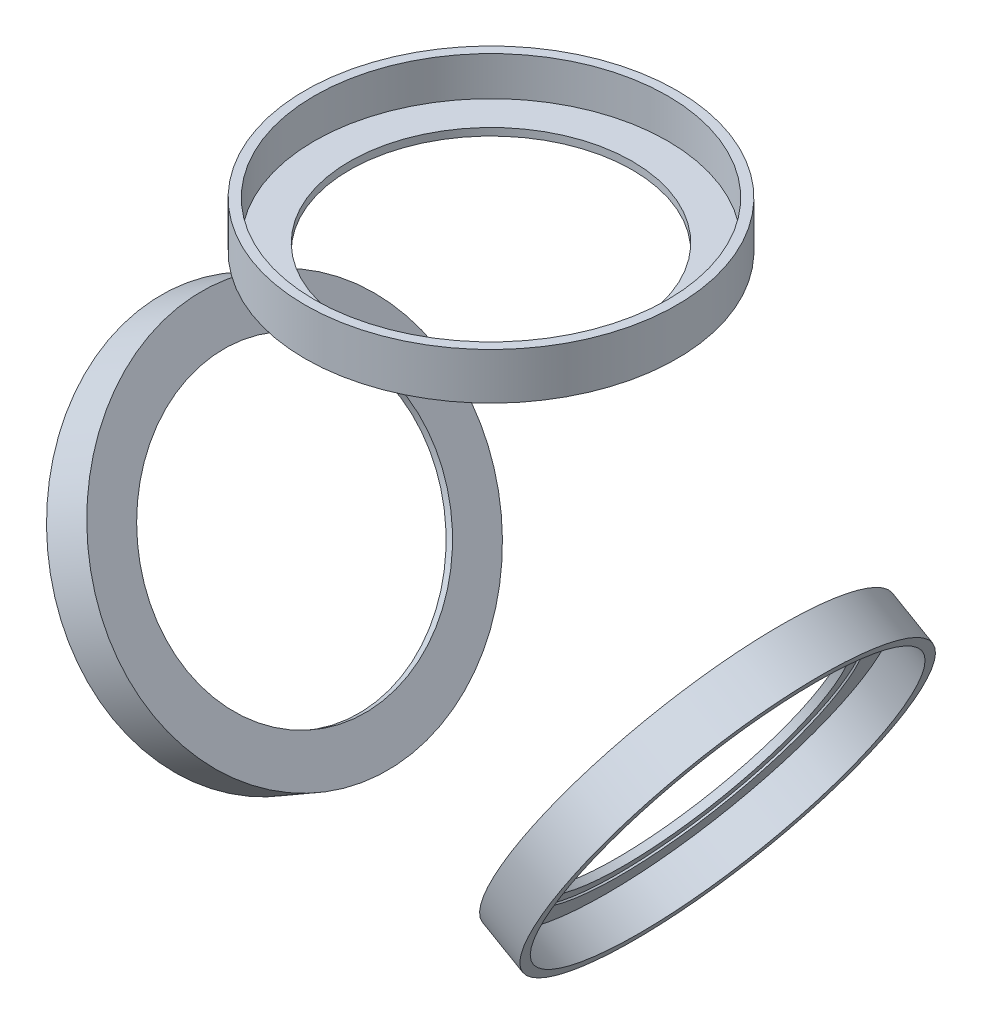
ISO-10303-21;
HEADER;
FILE_DESCRIPTION(('STEP AP214'),'2;1');
FILE_NAME('part.step','',(''),(''),'','','');
FILE_SCHEMA(('AUTOMOTIVE_DESIGN { 1 0 10303 214 1 1 1 1 }'));
ENDSEC;
DATA;
#1=APPLICATION_CONTEXT('core data for automotive mechanical design processes');
#2=APPLICATION_PROTOCOL_DEFINITION('international standard','automotive_design',2000,#1);
#3=PRODUCT_CONTEXT('',#1,'mechanical');
#4=PRODUCT('Part','Part','',(#3));
#5=PRODUCT_RELATED_PRODUCT_CATEGORY('part','',(#4));
#6=PRODUCT_DEFINITION_FORMATION('','',#4);
#7=PRODUCT_DEFINITION_CONTEXT('part definition',#1,'design');
#8=PRODUCT_DEFINITION('design','',#6,#7);
#9=PRODUCT_DEFINITION_SHAPE('','',#8);
#10=(LENGTH_UNIT() NAMED_UNIT(*) SI_UNIT(.MILLI.,.METRE.));
#11=(NAMED_UNIT(*) PLANE_ANGLE_UNIT() SI_UNIT($,.RADIAN.));
#12=(NAMED_UNIT(*) SI_UNIT($,.STERADIAN.) SOLID_ANGLE_UNIT());
#13=UNCERTAINTY_MEASURE_WITH_UNIT(LENGTH_MEASURE(1.E-05),#10,'distance_accuracy_value','');
#14=(GEOMETRIC_REPRESENTATION_CONTEXT(3) GLOBAL_UNCERTAINTY_ASSIGNED_CONTEXT((#13)) GLOBAL_UNIT_ASSIGNED_CONTEXT((#10,
#11,#12)) REPRESENTATION_CONTEXT('',''));
#15=CARTESIAN_POINT('',(0.,0.,0.));
#16=DIRECTION('',(0.,0.,1.));
#17=DIRECTION('',(1.,0.,0.));
#18=AXIS2_PLACEMENT_3D('',#15,#16,#17);
#19=CARTESIAN_POINT('',(-109.985230030108,-63.5000021647657,82.));
#20=DIRECTION('',(-0.866025403784439,-0.5,0.));
#21=DIRECTION('',(-0.5,0.866025403784439,0.));
#22=AXIS2_PLACEMENT_3D('',#19,#20,#21);
#23=PLANE('',#22);
#24=CARTESIAN_POINT('',(-109.985230030108,-63.5000021647657,0.));
#25=DIRECTION('',(-0.866025403784439,-0.5,0.));
#26=DIRECTION('',(-0.5,0.866025403784439,0.));
#27=AXIS2_PLACEMENT_3D('',#24,#25,#26);
#28=CIRCLE('',#27,82.);
#29=CARTESIAN_POINT('',(-109.985230030108,-63.5000021647658,-82.));
#30=VERTEX_POINT('',#29);
#31=EDGE_CURVE('P0_E20',#30,#30,#28,.T.);
#32=ORIENTED_EDGE('',*,*,#31,.F.);
#33=EDGE_LOOP('',(#32));
#34=FACE_BOUND('',#33,.T.);
#35=CARTESIAN_POINT('',(-109.985230030108,-63.5000021647657,0.));
#36=DIRECTION('',(-0.866025403784439,-0.5,0.));
#37=DIRECTION('',(-0.5,0.866025403784439,0.));
#38=AXIS2_PLACEMENT_3D('',#35,#36,#37);
#39=CIRCLE('',#38,95.);
#40=CARTESIAN_POINT('',(-109.985230030108,-63.5000021647658,-95.));
#41=VERTEX_POINT('',#40);
#42=EDGE_CURVE('P0_E89',#41,#41,#39,.T.);
#43=ORIENTED_EDGE('',*,*,#42,.T.);
#44=EDGE_LOOP('',(#43));
#45=FACE_BOUND('',#44,.T.);
#46=ADVANCED_FACE('P0_F17',(#34,#45),#23,.T.);
#47=CARTESIAN_POINT('',(-109.552217328216,-63.2500021647657,0.));
#48=DIRECTION('',(-0.866025403784439,-0.5,0.));
#49=DIRECTION('',(0.,0.,1.));
#50=AXIS2_PLACEMENT_3D('',#47,#48,#49);
#51=CYLINDRICAL_SURFACE('',#50,82.);
#52=ORIENTED_EDGE('',*,*,#31,.T.);
#53=DIRECTION('',(0.866025403784439,0.5,0.));
#54=VECTOR('',#53,1.);
#55=CARTESIAN_POINT('',(-109.552217328216,-63.2500021647658,-82.));
#56=LINE('',#55,#54);
#57=CARTESIAN_POINT('',(-109.119204626323,-63.0000021647658,-82.));
#58=VERTEX_POINT('',#57);
#59=EDGE_CURVE('P0_E11',#30,#58,#56,.T.);
#60=ORIENTED_EDGE('',*,*,#59,.T.);
#61=CARTESIAN_POINT('',(-109.119204626323,-63.0000021647657,0.));
#62=DIRECTION('',(-0.866025403784439,-0.5,0.));
#63=DIRECTION('',(-0.5,0.866025403784439,0.));
#64=AXIS2_PLACEMENT_3D('',#61,#62,#63);
#65=CIRCLE('',#64,82.);
#66=EDGE_CURVE('P0_E72',#58,#58,#65,.T.);
#67=ORIENTED_EDGE('',*,*,#66,.F.);
#68=ORIENTED_EDGE('',*,*,#59,.F.);
#69=EDGE_LOOP('',(#52,#60,#67,#68));
#70=FACE_BOUND('',#69,.T.);
#71=ADVANCED_FACE('P0_F126',(#70),#51,.F.);
#72=CARTESIAN_POINT('',(-109.119204626323,-63.0000021647657,76.));
#73=DIRECTION('',(-0.866025403784439,-0.5,0.));
#74=DIRECTION('',(-0.5,0.866025403784439,0.));
#75=AXIS2_PLACEMENT_3D('',#72,#73,#74);
#76=PLANE('',#75);
#77=CARTESIAN_POINT('',(-109.119204626323,-63.0000021647657,0.));
#78=DIRECTION('',(-0.866025403784439,-0.5,0.));
#79=DIRECTION('',(-0.5,0.866025403784439,0.));
#80=AXIS2_PLACEMENT_3D('',#77,#78,#79);
#81=CIRCLE('',#80,76.);
#82=CARTESIAN_POINT('',(-109.119204626323,-63.0000021647658,-76.));
#83=VERTEX_POINT('',#82);
#84=EDGE_CURVE('P0_E70',#83,#83,#81,.T.);
#85=ORIENTED_EDGE('',*,*,#84,.F.);
#86=EDGE_LOOP('',(#85));
#87=FACE_BOUND('',#86,.T.);
#88=ORIENTED_EDGE('',*,*,#66,.T.);
#89=EDGE_LOOP('',(#88));
#90=FACE_BOUND('',#89,.T.);
#91=ADVANCED_FACE('P0_F123',(#87,#90),#76,.T.);
#92=CARTESIAN_POINT('',(-107.387153818755,-62.0000021647657,0.));
#93=DIRECTION('',(-0.866025403784439,-0.5,0.));
#94=DIRECTION('',(0.,0.,1.));
#95=AXIS2_PLACEMENT_3D('',#92,#93,#94);
#96=CYLINDRICAL_SURFACE('',#95,76.);
#97=ORIENTED_EDGE('',*,*,#84,.T.);
#98=DIRECTION('',(0.866025403784439,0.5,0.));
#99=VECTOR('',#98,1.);
#100=CARTESIAN_POINT('',(-107.387153818755,-62.0000021647658,-76.));
#101=LINE('',#100,#99);
#102=CARTESIAN_POINT('',(-105.655103011186,-61.0000021647657,-76.));
#103=VERTEX_POINT('',#102);
#104=EDGE_CURVE('P0_E65',#83,#103,#101,.T.);
#105=ORIENTED_EDGE('',*,*,#104,.T.);
#106=CARTESIAN_POINT('',(-105.655103011186,-61.0000021647657,0.));
#107=DIRECTION('',(-0.866025403784439,-0.5,0.));
#108=DIRECTION('',(-0.5,0.866025403784439,0.));
#109=AXIS2_PLACEMENT_3D('',#106,#107,#108);
#110=CIRCLE('',#109,76.);
#111=EDGE_CURVE('P0_E68',#103,#103,#110,.T.);
#112=ORIENTED_EDGE('',*,*,#111,.F.);
#113=ORIENTED_EDGE('',*,*,#104,.F.);
#114=EDGE_LOOP('',(#97,#105,#112,#113));
#115=FACE_BOUND('',#114,.T.);
#116=ADVANCED_FACE('P0_F67',(#115),#96,.F.);
#117=CARTESIAN_POINT('',(-105.655103011186,-61.0000021647657,100.));
#118=DIRECTION('',(0.866025403784439,0.5,0.));
#119=DIRECTION('',(0.,0.,-1.));
#120=AXIS2_PLACEMENT_3D('',#117,#118,#119);
#121=PLANE('',#120);
#122=ORIENTED_EDGE('',*,*,#111,.T.);
#123=EDGE_LOOP('',(#122));
#124=FACE_BOUND('',#123,.T.);
#125=CARTESIAN_POINT('',(-105.655103011186,-61.0000021647657,0.));
#126=DIRECTION('',(-0.866025403784439,-0.5,0.));
#127=DIRECTION('',(-0.5,0.866025403784439,0.));
#128=AXIS2_PLACEMENT_3D('',#125,#126,#127);
#129=CIRCLE('',#128,100.);
#130=CARTESIAN_POINT('',(-105.655103011186,-61.0000021647657,-100.));
#131=VERTEX_POINT('',#130);
#132=EDGE_CURVE('P0_E78',#131,#131,#129,.T.);
#133=ORIENTED_EDGE('',*,*,#132,.F.);
#134=EDGE_LOOP('',(#133));
#135=FACE_BOUND('',#134,.T.);
#136=ADVANCED_FACE('P0_F75',(#124,#135),#121,.T.);
#137=CARTESIAN_POINT('',(-116.480420558491,-67.2500021647657,0.));
#138=DIRECTION('',(-0.866025403784439,-0.5,0.));
#139=DIRECTION('',(0.,0.,1.));
#140=AXIS2_PLACEMENT_3D('',#137,#138,#139);
#141=CYLINDRICAL_SURFACE('',#140,100.);
#142=CARTESIAN_POINT('',(-127.30574092966,-73.5000037951238,0.));
#143=DIRECTION('',(-0.866025406369398,-0.499999995522719,0.));
#144=DIRECTION('',(-0.499999995522719,0.866025406369398,0.));
#145=AXIS2_PLACEMENT_3D('',#142,#143,#144);
#146=CIRCLE('',#145,100.);
#147=CARTESIAN_POINT('',(-127.305741377388,-73.5000040536197,-100.));
#148=VERTEX_POINT('',#147);
#149=EDGE_CURVE('P0_E102',#148,#148,#146,.T.);
#150=ORIENTED_EDGE('',*,*,#149,.F.);
#151=DIRECTION('',(0.866025403784439,0.5,0.));
#152=VECTOR('',#151,1.);
#153=CARTESIAN_POINT('',(-116.480420558491,-67.2500021647658,-100.));
#154=LINE('',#153,#152);
#155=EDGE_CURVE('P0_E85',#148,#131,#154,.T.);
#156=ORIENTED_EDGE('',*,*,#155,.T.);
#157=ORIENTED_EDGE('',*,*,#132,.T.);
#158=ORIENTED_EDGE('',*,*,#155,.F.);
#159=EDGE_LOOP('',(#150,#156,#157,#158));
#160=FACE_BOUND('',#159,.T.);
#161=ADVANCED_FACE('P0_F112',(#160),#141,.T.);
#162=CARTESIAN_POINT('',(-118.645484067952,-68.5000021647657,0.));
#163=DIRECTION('',(-0.866025403784439,-0.5,0.));
#164=DIRECTION('',(0.,0.,1.));
#165=AXIS2_PLACEMENT_3D('',#162,#163,#164);
#166=CYLINDRICAL_SURFACE('',#165,95.);
#167=CARTESIAN_POINT('',(-127.30574092966,-73.5000037951238,0.));
#168=DIRECTION('',(-0.866025406369398,-0.499999995522719,0.));
#169=DIRECTION('',(0.,0.,1.));
#170=AXIS2_PLACEMENT_3D('',#167,#168,#169);
#171=CIRCLE('',#170,95.);
#172=CARTESIAN_POINT('',(-127.30574092966,-73.5000037951238,-95.));
#173=VERTEX_POINT('',#172);
#174=EDGE_CURVE('P0_E96',#173,#173,#171,.T.);
#175=ORIENTED_EDGE('',*,*,#174,.T.);
#176=DIRECTION('',(0.866025403784438,0.5,0.));
#177=VECTOR('',#176,1.);
#178=CARTESIAN_POINT('',(-118.645484067952,-68.5000021647658,-95.));
#179=LINE('',#178,#177);
#180=EDGE_CURVE('P0_E92',#173,#41,#179,.T.);
#181=ORIENTED_EDGE('',*,*,#180,.T.);
#182=ORIENTED_EDGE('',*,*,#42,.F.);
#183=ORIENTED_EDGE('',*,*,#180,.F.);
#184=EDGE_LOOP('',(#175,#181,#182,#183));
#185=FACE_BOUND('',#184,.T.);
#186=ADVANCED_FACE('P0_F121',(#185),#166,.F.);
#187=CARTESIAN_POINT('',(-127.883090948532,-72.5000042167459,37.5));
#188=DIRECTION('',(0.866025406369398,0.499999995522719,0.));
#189=DIRECTION('',(0.,0.,-1.));
#190=AXIS2_PLACEMENT_3D('',#187,#188,#189);
#191=PLANE('',#190);
#192=ORIENTED_EDGE('',*,*,#174,.F.);
#193=EDGE_LOOP('',(#192));
#194=FACE_BOUND('',#193,.T.);
#195=ORIENTED_EDGE('',*,*,#149,.T.);
#196=EDGE_LOOP('',(#195));
#197=FACE_BOUND('',#196,.T.);
#198=ADVANCED_FACE('P0_F109',(#194,#197),#191,.F.);
#199=CLOSED_SHELL('',(#46,#71,#91,#116,#136,#161,#186,#198));
#200=MANIFOLD_SOLID_BREP('P0_B1',#199);
#201=CARTESIAN_POINT('',(118.645484067952,-68.5000021647657,0.));
#202=DIRECTION('',(0.866025403784439,-0.5,0.));
#203=DIRECTION('',(0.,0.,1.));
#204=AXIS2_PLACEMENT_3D('',#201,#202,#203);
#205=CYLINDRICAL_SURFACE('',#204,95.);
#206=CARTESIAN_POINT('',(127.305738105797,-73.5000021647657,0.));
#207=DIRECTION('',(0.866025403784439,-0.5,0.));
#208=DIRECTION('',(-0.5,-0.866025403784439,0.));
#209=AXIS2_PLACEMENT_3D('',#206,#207,#208);
#210=CIRCLE('',#209,95.);
#211=CARTESIAN_POINT('',(127.305738105797,-73.5000021647657,-95.));
#212=VERTEX_POINT('',#211);
#213=EDGE_CURVE('P1_E25',#212,#212,#210,.T.);
#214=ORIENTED_EDGE('',*,*,#213,.T.);
#215=DIRECTION('',(-0.866025403784439,0.5,0.));
#216=VECTOR('',#215,1.);
#217=CARTESIAN_POINT('',(118.645484067952,-68.5000021647657,-95.));
#218=LINE('',#217,#216);
#219=CARTESIAN_POINT('',(109.985230030108,-63.5000021647657,-95.));
#220=VERTEX_POINT('',#219);
#221=EDGE_CURVE('P1_E11',#212,#220,#218,.T.);
#222=ORIENTED_EDGE('',*,*,#221,.T.);
#223=CARTESIAN_POINT('',(109.985230030108,-63.5000021647657,0.));
#224=DIRECTION('',(0.866025403784439,-0.5,0.));
#225=DIRECTION('',(-0.5,-0.866025403784439,0.));
#226=AXIS2_PLACEMENT_3D('',#223,#224,#225);
#227=CIRCLE('',#226,95.);
#228=EDGE_CURVE('P1_E69',#220,#220,#227,.T.);
#229=ORIENTED_EDGE('',*,*,#228,.F.);
#230=ORIENTED_EDGE('',*,*,#221,.F.);
#231=EDGE_LOOP('',(#214,#222,#229,#230));
#232=FACE_BOUND('',#231,.T.);
#233=ADVANCED_FACE('P1_F17',(#232),#205,.F.);
#234=CARTESIAN_POINT('',(127.305738105797,-73.5000021647657,195.));
#235=DIRECTION('',(0.866025403784439,-0.5,0.));
#236=DIRECTION('',(0.,0.,-1.));
#237=AXIS2_PLACEMENT_3D('',#234,#235,#236);
#238=PLANE('',#237);
#239=ORIENTED_EDGE('',*,*,#213,.F.);
#240=EDGE_LOOP('',(#239));
#241=FACE_BOUND('',#240,.T.);
#242=CARTESIAN_POINT('',(127.305738105797,-73.5000021647657,0.));
#243=DIRECTION('',(0.866025403784439,-0.5,0.));
#244=DIRECTION('',(-0.5,-0.866025403784439,0.));
#245=AXIS2_PLACEMENT_3D('',#242,#243,#244);
#246=CIRCLE('',#245,100.);
#247=CARTESIAN_POINT('',(127.305738105797,-73.5000021647657,-100.));
#248=VERTEX_POINT('',#247);
#249=EDGE_CURVE('P1_E84',#248,#248,#246,.T.);
#250=ORIENTED_EDGE('',*,*,#249,.T.);
#251=EDGE_LOOP('',(#250));
#252=FACE_BOUND('',#251,.T.);
#253=ADVANCED_FACE('P1_F163',(#241,#252),#238,.T.);
#254=CARTESIAN_POINT('',(116.480420558491,-67.2500021647657,0.));
#255=DIRECTION('',(0.866025403784439,-0.5,0.));
#256=DIRECTION('',(0.,0.,1.));
#257=AXIS2_PLACEMENT_3D('',#254,#255,#256);
#258=CYLINDRICAL_SURFACE('',#257,100.);
#259=ORIENTED_EDGE('',*,*,#249,.F.);
#260=DIRECTION('',(-0.866025403784439,0.5,0.));
#261=VECTOR('',#260,1.);
#262=CARTESIAN_POINT('',(116.480420558491,-67.2500021647657,-100.));
#263=LINE('',#262,#261);
#264=CARTESIAN_POINT('',(105.655103011186,-61.0000021647657,-100.));
#265=VERTEX_POINT('',#264);
#266=EDGE_CURVE('P1_E44',#248,#265,#263,.T.);
#267=ORIENTED_EDGE('',*,*,#266,.T.);
#268=CARTESIAN_POINT('',(105.655103011186,-61.0000021647657,0.));
#269=DIRECTION('',(0.866025403784439,-0.5,0.));
#270=DIRECTION('',(-0.5,-0.866025403784439,0.));
#271=AXIS2_PLACEMENT_3D('',#268,#269,#270);
#272=CIRCLE('',#271,100.);
#273=EDGE_CURVE('P1_E87',#265,#265,#272,.T.);
#274=ORIENTED_EDGE('',*,*,#273,.T.);
#275=ORIENTED_EDGE('',*,*,#266,.F.);
#276=EDGE_LOOP('',(#259,#267,#274,#275));
#277=FACE_BOUND('',#276,.T.);
#278=ADVANCED_FACE('P1_F154',(#277),#258,.T.);
#279=CARTESIAN_POINT('',(105.655103011186,-61.0000021647657,100.));
#280=DIRECTION('',(-0.866025403784439,0.5,0.));
#281=DIRECTION('',(0.,0.,1.));
#282=AXIS2_PLACEMENT_3D('',#279,#280,#281);
#283=PLANE('',#282);
#284=CARTESIAN_POINT('',(105.655103011186,-61.0000021647657,0.));
#285=DIRECTION('',(0.866025403784439,-0.5,0.));
#286=DIRECTION('',(-0.5,-0.866025403784439,0.));
#287=AXIS2_PLACEMENT_3D('',#284,#285,#286);
#288=CIRCLE('',#287,76.);
#289=CARTESIAN_POINT('',(105.655103011186,-61.0000021647657,-76.));
#290=VERTEX_POINT('',#289);
#291=EDGE_CURVE('P1_E88',#290,#290,#288,.T.);
#292=ORIENTED_EDGE('',*,*,#291,.T.);
#293=EDGE_LOOP('',(#292));
#294=FACE_BOUND('',#293,.T.);
#295=ORIENTED_EDGE('',*,*,#273,.F.);
#296=EDGE_LOOP('',(#295));
#297=FACE_BOUND('',#296,.T.);
#298=ADVANCED_FACE('P1_F145',(#294,#297),#283,.T.);
#299=CARTESIAN_POINT('',(107.387153818755,-62.0000021647657,0.));
#300=DIRECTION('',(0.866025403784439,-0.5,0.));
#301=DIRECTION('',(0.,0.,1.));
#302=AXIS2_PLACEMENT_3D('',#299,#300,#301);
#303=CYLINDRICAL_SURFACE('',#302,76.);
#304=CARTESIAN_POINT('',(109.119204626323,-63.0000021647657,0.));
#305=DIRECTION('',(0.866025403784439,-0.5,0.));
#306=DIRECTION('',(-0.5,-0.866025403784439,0.));
#307=AXIS2_PLACEMENT_3D('',#304,#305,#306);
#308=CIRCLE('',#307,76.);
#309=CARTESIAN_POINT('',(109.119204626323,-63.0000021647657,-76.));
#310=VERTEX_POINT('',#309);
#311=EDGE_CURVE('P1_E98',#310,#310,#308,.T.);
#312=ORIENTED_EDGE('',*,*,#311,.T.);
#313=DIRECTION('',(-0.866025403784439,0.5,0.));
#314=VECTOR('',#313,1.);
#315=CARTESIAN_POINT('',(107.387153818755,-62.0000021647657,-76.));
#316=LINE('',#315,#314);
#317=EDGE_CURVE('P1_E91',#310,#290,#316,.T.);
#318=ORIENTED_EDGE('',*,*,#317,.T.);
#319=ORIENTED_EDGE('',*,*,#291,.F.);
#320=ORIENTED_EDGE('',*,*,#317,.F.);
#321=EDGE_LOOP('',(#312,#318,#319,#320));
#322=FACE_BOUND('',#321,.T.);
#323=ADVANCED_FACE('P1_F129',(#322),#303,.F.);
#324=CARTESIAN_POINT('',(109.119204626323,-63.0000021647657,76.));
#325=DIRECTION('',(0.866025403784439,-0.5,0.));
#326=DIRECTION('',(0.,0.,-1.));
#327=AXIS2_PLACEMENT_3D('',#324,#325,#326);
#328=PLANE('',#327);
#329=ORIENTED_EDGE('',*,*,#311,.F.);
#330=EDGE_LOOP('',(#329));
#331=FACE_BOUND('',#330,.T.);
#332=CARTESIAN_POINT('',(109.119204626323,-63.0000021647657,0.));
#333=DIRECTION('',(0.866025403784439,-0.5,0.));
#334=DIRECTION('',(-0.5,-0.866025403784439,0.));
#335=AXIS2_PLACEMENT_3D('',#332,#333,#334);
#336=CIRCLE('',#335,82.);
#337=CARTESIAN_POINT('',(109.119204626323,-63.0000021647657,-82.));
#338=VERTEX_POINT('',#337);
#339=EDGE_CURVE('P1_E95',#338,#338,#336,.T.);
#340=ORIENTED_EDGE('',*,*,#339,.T.);
#341=EDGE_LOOP('',(#340));
#342=FACE_BOUND('',#341,.T.);
#343=ADVANCED_FACE('P1_F124',(#331,#342),#328,.T.);
#344=CARTESIAN_POINT('',(109.552217328216,-63.2500021647657,0.));
#345=DIRECTION('',(0.866025403784439,-0.5,0.));
#346=DIRECTION('',(0.,0.,1.));
#347=AXIS2_PLACEMENT_3D('',#344,#345,#346);
#348=CYLINDRICAL_SURFACE('',#347,82.);
#349=CARTESIAN_POINT('',(109.985230030108,-63.5000021647657,0.));
#350=DIRECTION('',(0.866025403784439,-0.5,0.));
#351=DIRECTION('',(-0.5,-0.866025403784439,0.));
#352=AXIS2_PLACEMENT_3D('',#349,#350,#351);
#353=CIRCLE('',#352,82.);
#354=CARTESIAN_POINT('',(109.985230030108,-63.5000021647657,-82.));
#355=VERTEX_POINT('',#354);
#356=EDGE_CURVE('P1_E74',#355,#355,#353,.T.);
#357=ORIENTED_EDGE('',*,*,#356,.T.);
#358=DIRECTION('',(-0.866025403784439,0.5,0.));
#359=VECTOR('',#358,1.);
#360=CARTESIAN_POINT('',(109.552217328216,-63.2500021647657,-82.));
#361=LINE('',#360,#359);
#362=EDGE_CURVE('P1_E79',#355,#338,#361,.T.);
#363=ORIENTED_EDGE('',*,*,#362,.T.);
#364=ORIENTED_EDGE('',*,*,#339,.F.);
#365=ORIENTED_EDGE('',*,*,#362,.F.);
#366=EDGE_LOOP('',(#357,#363,#364,#365));
#367=FACE_BOUND('',#366,.T.);
#368=ADVANCED_FACE('P1_F117',(#367),#348,.F.);
#369=CARTESIAN_POINT('',(109.985230030108,-63.5000021647657,82.));
#370=DIRECTION('',(0.866025403784439,-0.5,0.));
#371=DIRECTION('',(0.,0.,-1.));
#372=AXIS2_PLACEMENT_3D('',#369,#370,#371);
#373=PLANE('',#372);
#374=ORIENTED_EDGE('',*,*,#356,.F.);
#375=EDGE_LOOP('',(#374));
#376=FACE_BOUND('',#375,.T.);
#377=ORIENTED_EDGE('',*,*,#228,.T.);
#378=EDGE_LOOP('',(#377));
#379=FACE_BOUND('',#378,.T.);
#380=ADVANCED_FACE('P1_F72',(#376,#379),#373,.T.);
#381=CLOSED_SHELL('',(#233,#253,#278,#298,#323,#343,#368,#380));
#382=MANIFOLD_SOLID_BREP('P1_B1',#381);
#383=CARTESIAN_POINT('',(0.,134.500004329531,0.));
#384=DIRECTION('',(0.,1.,0.));
#385=DIRECTION('',(0.,0.,1.));
#386=AXIS2_PLACEMENT_3D('',#383,#384,#385);
#387=CYLINDRICAL_SURFACE('',#386,100.);
#388=CARTESIAN_POINT('',(0.,147.000004329531,0.));
#389=DIRECTION('',(-1.37761646906916E-10,1.,0.));
#390=DIRECTION('',(0.,0.,1.));
#391=AXIS2_PLACEMENT_3D('',#388,#389,#390);
#392=CIRCLE('',#391,100.);
#393=CARTESIAN_POINT('',(0.,147.000004343307,-100.));
#394=VERTEX_POINT('',#393);
#395=EDGE_CURVE('P2_E82',#394,#394,#392,.T.);
#396=ORIENTED_EDGE('',*,*,#395,.F.);
#397=DIRECTION('',(0.,-1.,0.));
#398=VECTOR('',#397,1.);
#399=CARTESIAN_POINT('',(0.,134.500004329531,-100.));
#400=LINE('',#399,#398);
#401=CARTESIAN_POINT('',(0.,122.000004329531,-100.));
#402=VERTEX_POINT('',#401);
#403=EDGE_CURVE('P2_E11',#394,#402,#400,.T.);
#404=ORIENTED_EDGE('',*,*,#403,.T.);
#405=CARTESIAN_POINT('',(0.,122.000004329531,0.));
#406=DIRECTION('',(0.,1.,0.));
#407=DIRECTION('',(1.,0.,0.));
#408=AXIS2_PLACEMENT_3D('',#405,#406,#407);
#409=CIRCLE('',#408,100.);
#410=EDGE_CURVE('P2_E20',#402,#402,#409,.T.);
#411=ORIENTED_EDGE('',*,*,#410,.T.);
#412=ORIENTED_EDGE('',*,*,#403,.F.);
#413=EDGE_LOOP('',(#396,#404,#411,#412));
#414=FACE_BOUND('',#413,.T.);
#415=ADVANCED_FACE('P2_F17',(#414),#387,.T.);
#416=CARTESIAN_POINT('',(0.,122.000004329531,200.));
#417=DIRECTION('',(0.,-1.,0.));
#418=DIRECTION('',(0.,0.,-1.));
#419=AXIS2_PLACEMENT_3D('',#416,#417,#418);
#420=PLANE('',#419);
#421=CARTESIAN_POINT('',(0.,122.000004329531,0.));
#422=DIRECTION('',(0.,1.,0.));
#423=DIRECTION('',(1.,0.,0.));
#424=AXIS2_PLACEMENT_3D('',#421,#422,#423);
#425=CIRCLE('',#424,76.);
#426=CARTESIAN_POINT('',(0.,122.000004329531,-76.));
#427=VERTEX_POINT('',#426);
#428=EDGE_CURVE('P2_E59',#427,#427,#425,.T.);
#429=ORIENTED_EDGE('',*,*,#428,.T.);
#430=EDGE_LOOP('',(#429));
#431=FACE_BOUND('',#430,.T.);
#432=ORIENTED_EDGE('',*,*,#410,.F.);
#433=EDGE_LOOP('',(#432));
#434=FACE_BOUND('',#433,.T.);
#435=ADVANCED_FACE('P2_F97',(#431,#434),#420,.T.);
#436=CARTESIAN_POINT('',(0.,124.000004329531,0.));
#437=DIRECTION('',(0.,1.,0.));
#438=DIRECTION('',(0.,0.,1.));
#439=AXIS2_PLACEMENT_3D('',#436,#437,#438);
#440=CYLINDRICAL_SURFACE('',#439,76.);
#441=CARTESIAN_POINT('',(0.,126.000004329531,0.));
#442=DIRECTION('',(0.,1.,0.));
#443=DIRECTION('',(1.,0.,0.));
#444=AXIS2_PLACEMENT_3D('',#441,#442,#443);
#445=CIRCLE('',#444,76.);
#446=CARTESIAN_POINT('',(0.,126.000004329531,-76.));
#447=VERTEX_POINT('',#446);
#448=EDGE_CURVE('P2_E58',#447,#447,#445,.T.);
#449=ORIENTED_EDGE('',*,*,#448,.T.);
#450=DIRECTION('',(0.,-1.,0.));
#451=VECTOR('',#450,1.);
#452=CARTESIAN_POINT('',(0.,124.000004329531,-76.));
#453=LINE('',#452,#451);
#454=EDGE_CURVE('P2_E55',#447,#427,#453,.T.);
#455=ORIENTED_EDGE('',*,*,#454,.T.);
#456=ORIENTED_EDGE('',*,*,#428,.F.);
#457=ORIENTED_EDGE('',*,*,#454,.F.);
#458=EDGE_LOOP('',(#449,#455,#456,#457));
#459=FACE_BOUND('',#458,.T.);
#460=ADVANCED_FACE('P2_F56',(#459),#440,.F.);
#461=CARTESIAN_POINT('',(0.,126.000004329531,176.));
#462=DIRECTION('',(0.,1.,0.));
#463=DIRECTION('',(1.,0.,0.));
#464=AXIS2_PLACEMENT_3D('',#461,#462,#463);
#465=PLANE('',#464);
#466=ORIENTED_EDGE('',*,*,#448,.F.);
#467=EDGE_LOOP('',(#466));
#468=FACE_BOUND('',#467,.T.);
#469=CARTESIAN_POINT('',(0.,126.000004329531,0.));
#470=DIRECTION('',(0.,1.,0.));
#471=DIRECTION('',(0.,0.,1.));
#472=AXIS2_PLACEMENT_3D('',#469,#470,#471);
#473=CIRCLE('',#472,95.);
#474=CARTESIAN_POINT('',(0.,126.000004329531,-95.));
#475=VERTEX_POINT('',#474);
#476=EDGE_CURVE('P2_E66',#475,#475,#473,.T.);
#477=ORIENTED_EDGE('',*,*,#476,.T.);
#478=EDGE_LOOP('',(#477));
#479=FACE_BOUND('',#478,.T.);
#480=ADVANCED_FACE('P2_F109',(#468,#479),#465,.T.);
#481=CARTESIAN_POINT('',(0.,137.000004329531,0.));
#482=DIRECTION('',(0.,1.,0.));
#483=DIRECTION('',(0.,0.,1.));
#484=AXIS2_PLACEMENT_3D('',#481,#482,#483);
#485=CYLINDRICAL_SURFACE('',#484,95.);
#486=CARTESIAN_POINT('',(-5.18416621406361E-08,147.000004329531,0.));
#487=DIRECTION('',(-1.37761646906916E-10,1.,0.));
#488=DIRECTION('',(-1.,-1.37761646906916E-10,0.));
#489=AXIS2_PLACEMENT_3D('',#486,#487,#488);
#490=CIRCLE('',#489,95.);
#491=CARTESIAN_POINT('',(94.9999999481583,147.000004342619,0.));
#492=VERTEX_POINT('',#491);
#493=CARTESIAN_POINT('',(0.,147.000004342619,-95.));
#494=VERTEX_POINT('',#493);
#495=EDGE_CURVE('P2_E79',#492,#494,#490,.T.);
#496=ORIENTED_EDGE('',*,*,#495,.T.);
#497=DIRECTION('',(0.,-1.,0.));
#498=VECTOR('',#497,1.);
#499=CARTESIAN_POINT('',(0.,137.000004329531,-95.));
#500=LINE('',#499,#498);
#501=EDGE_CURVE('P2_E71',#494,#475,#500,.T.);
#502=ORIENTED_EDGE('',*,*,#501,.T.);
#503=ORIENTED_EDGE('',*,*,#476,.F.);
#504=ORIENTED_EDGE('',*,*,#501,.F.);
#505=CARTESIAN_POINT('',(-5.18416621406361E-08,147.000004329531,0.));
#506=DIRECTION('',(-1.37761646906916E-10,1.,0.));
#507=DIRECTION('',(-1.,-1.37761646906916E-10,0.));
#508=AXIS2_PLACEMENT_3D('',#505,#506,#507);
#509=CIRCLE('',#508,95.);
#510=EDGE_CURVE('P2_E74',#494,#492,#509,.T.);
#511=ORIENTED_EDGE('',*,*,#510,.T.);
#512=EDGE_LOOP('',(#496,#502,#503,#504,#511));
#513=FACE_BOUND('',#512,.T.);
#514=ADVANCED_FACE('P2_F114',(#513),#485,.F.);
#515=CARTESIAN_POINT('',(-1.4202736631326E-08,147.000004329531,37.5));
#516=DIRECTION('',(1.37761646906916E-10,-1.,0.));
#517=DIRECTION('',(0.,0.,-1.));
#518=AXIS2_PLACEMENT_3D('',#515,#516,#517);
#519=PLANE('',#518);
#520=ORIENTED_EDGE('',*,*,#495,.F.);
#521=ORIENTED_EDGE('',*,*,#510,.F.);
#522=EDGE_LOOP('',(#520,#521));
#523=FACE_BOUND('',#522,.T.);
#524=ORIENTED_EDGE('',*,*,#395,.T.);
#525=EDGE_LOOP('',(#524));
#526=FACE_BOUND('',#525,.T.);
#527=ADVANCED_FACE('P2_F89',(#523,#526),#519,.F.);
#528=CLOSED_SHELL('',(#415,#435,#460,#480,#514,#527));
#529=MANIFOLD_SOLID_BREP('P2_B1',#528);
#530=ADVANCED_BREP_SHAPE_REPRESENTATION('',(#18,#200,#382,#529),#14);
#531=SHAPE_DEFINITION_REPRESENTATION(#9,#530);
ENDSEC;
END-ISO-10303-21;
